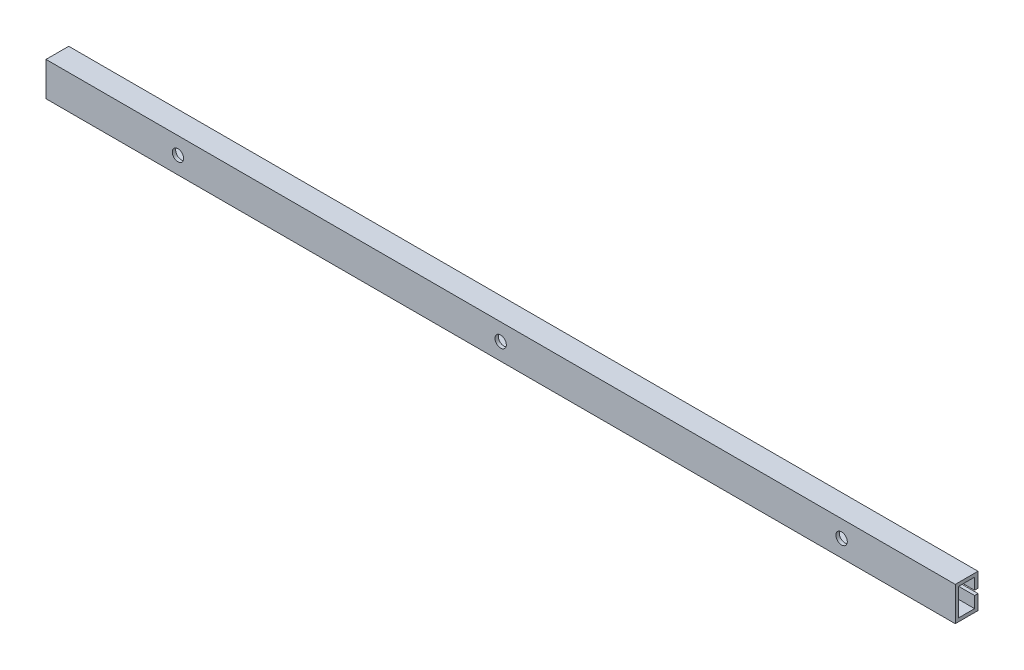
ISO-10303-21;
HEADER;
FILE_DESCRIPTION(('STEP AP214'),'2;1');
FILE_NAME('part.step','',(''),(''),'','','');
FILE_SCHEMA(('AUTOMOTIVE_DESIGN { 1 0 10303 214 1 1 1 1 }'));
ENDSEC;
DATA;
#1=APPLICATION_CONTEXT('core data for automotive mechanical design processes');
#2=APPLICATION_PROTOCOL_DEFINITION('international standard','automotive_design',2000,#1);
#3=PRODUCT_CONTEXT('',#1,'mechanical');
#4=PRODUCT('Part','Part','',(#3));
#5=PRODUCT_RELATED_PRODUCT_CATEGORY('part','',(#4));
#6=PRODUCT_DEFINITION_FORMATION('','',#4);
#7=PRODUCT_DEFINITION_CONTEXT('part definition',#1,'design');
#8=PRODUCT_DEFINITION('design','',#6,#7);
#9=PRODUCT_DEFINITION_SHAPE('','',#8);
#10=(LENGTH_UNIT() NAMED_UNIT(*) SI_UNIT(.MILLI.,.METRE.));
#11=(NAMED_UNIT(*) PLANE_ANGLE_UNIT() SI_UNIT($,.RADIAN.));
#12=(NAMED_UNIT(*) SI_UNIT($,.STERADIAN.) SOLID_ANGLE_UNIT());
#13=UNCERTAINTY_MEASURE_WITH_UNIT(LENGTH_MEASURE(1.E-05),#10,'distance_accuracy_value','');
#14=(GEOMETRIC_REPRESENTATION_CONTEXT(3) GLOBAL_UNCERTAINTY_ASSIGNED_CONTEXT((#13)) GLOBAL_UNIT_ASSIGNED_CONTEXT((#10,
#11,#12)) REPRESENTATION_CONTEXT('',''));
#15=CARTESIAN_POINT('',(0.,0.,0.));
#16=DIRECTION('',(0.,0.,1.));
#17=DIRECTION('',(1.,0.,0.));
#18=AXIS2_PLACEMENT_3D('',#15,#16,#17);
#19=CARTESIAN_POINT('',(0.,0.,0.));
#20=DIRECTION('',(0.,0.,1.));
#21=DIRECTION('',(1.,0.,0.));
#22=AXIS2_PLACEMENT_3D('',#19,#20,#21);
#23=PLANE('',#22);
#24=DIRECTION('',(1.,0.,0.));
#25=VECTOR('',#24,1.);
#26=CARTESIAN_POINT('',(-500.,17.,0.));
#27=LINE('',#26,#25);
#28=CARTESIAN_POINT('',(-400.,17.,0.));
#29=VERTEX_POINT('',#28);
#30=CARTESIAN_POINT('',(400.,17.,0.));
#31=VERTEX_POINT('',#30);
#32=EDGE_CURVE('E257',#29,#31,#27,.T.);
#33=ORIENTED_EDGE('',*,*,#32,.F.);
#34=DIRECTION('',(0.,1.,0.));
#35=VECTOR('',#34,1.);
#36=CARTESIAN_POINT('',(-400.,30.,0.));
#37=LINE('',#36,#35);
#38=CARTESIAN_POINT('',(-400.,30.,0.));
#39=VERTEX_POINT('',#38);
#40=EDGE_CURVE('E146',#29,#39,#37,.T.);
#41=ORIENTED_EDGE('',*,*,#40,.T.);
#42=DIRECTION('',(-1.,0.,0.));
#43=VECTOR('',#42,1.);
#44=CARTESIAN_POINT('',(-500.,30.,0.));
#45=LINE('',#44,#43);
#46=CARTESIAN_POINT('',(400.,30.,0.));
#47=VERTEX_POINT('',#46);
#48=EDGE_CURVE('E164',#47,#39,#45,.T.);
#49=ORIENTED_EDGE('',*,*,#48,.F.);
#50=DIRECTION('',(0.,-1.,0.));
#51=VECTOR('',#50,1.);
#52=CARTESIAN_POINT('',(400.,30.,0.));
#53=LINE('',#52,#51);
#54=EDGE_CURVE('E203',#47,#31,#53,.T.);
#55=ORIENTED_EDGE('',*,*,#54,.T.);
#56=EDGE_LOOP('',(#33,#41,#49,#55));
#57=FACE_BOUND('',#56,.T.);
#58=ADVANCED_FACE('F45',(#57),#23,.F.);
#59=CARTESIAN_POINT('',(-500.,30.,20.));
#60=DIRECTION('',(0.,-1.,0.));
#61=DIRECTION('',(0.,0.,-1.));
#62=AXIS2_PLACEMENT_3D('',#59,#60,#61);
#63=PLANE('',#62);
#64=ORIENTED_EDGE('',*,*,#48,.T.);
#65=DIRECTION('',(0.,0.,1.));
#66=VECTOR('',#65,1.);
#67=CARTESIAN_POINT('',(-400.,30.,0.));
#68=LINE('',#67,#66);
#69=CARTESIAN_POINT('',(-400.,30.,20.));
#70=VERTEX_POINT('',#69);
#71=EDGE_CURVE('E157',#39,#70,#68,.T.);
#72=ORIENTED_EDGE('',*,*,#71,.T.);
#73=DIRECTION('',(-1.,0.,0.));
#74=VECTOR('',#73,1.);
#75=CARTESIAN_POINT('',(-500.,30.,20.));
#76=LINE('',#75,#74);
#77=CARTESIAN_POINT('',(400.,30.,20.));
#78=VERTEX_POINT('',#77);
#79=EDGE_CURVE('E163',#78,#70,#76,.T.);
#80=ORIENTED_EDGE('',*,*,#79,.F.);
#81=DIRECTION('',(0.,0.,1.));
#82=VECTOR('',#81,1.);
#83=CARTESIAN_POINT('',(400.,30.,0.));
#84=LINE('',#83,#82);
#85=EDGE_CURVE('E188',#47,#78,#84,.T.);
#86=ORIENTED_EDGE('',*,*,#85,.F.);
#87=EDGE_LOOP('',(#64,#72,#80,#86));
#88=FACE_BOUND('',#87,.T.);
#89=ADVANCED_FACE('F47',(#88),#63,.F.);
#90=CARTESIAN_POINT('',(-500.,0.,20.));
#91=DIRECTION('',(0.,1.,0.));
#92=DIRECTION('',(0.,0.,1.));
#93=AXIS2_PLACEMENT_3D('',#90,#91,#92);
#94=PLANE('',#93);
#95=DIRECTION('',(1.,0.,0.));
#96=VECTOR('',#95,1.);
#97=CARTESIAN_POINT('',(-500.,0.,20.));
#98=LINE('',#97,#96);
#99=CARTESIAN_POINT('',(-400.,0.,20.));
#100=VERTEX_POINT('',#99);
#101=CARTESIAN_POINT('',(400.,0.,20.));
#102=VERTEX_POINT('',#101);
#103=EDGE_CURVE('E155',#100,#102,#98,.T.);
#104=ORIENTED_EDGE('',*,*,#103,.F.);
#105=DIRECTION('',(0.,0.,1.));
#106=VECTOR('',#105,1.);
#107=CARTESIAN_POINT('',(-400.,0.,0.));
#108=LINE('',#107,#106);
#109=CARTESIAN_POINT('',(-400.,0.,0.));
#110=VERTEX_POINT('',#109);
#111=EDGE_CURVE('E137',#110,#100,#108,.T.);
#112=ORIENTED_EDGE('',*,*,#111,.F.);
#113=DIRECTION('',(1.,0.,0.));
#114=VECTOR('',#113,1.);
#115=CARTESIAN_POINT('',(-500.,0.,0.));
#116=LINE('',#115,#114);
#117=CARTESIAN_POINT('',(400.,0.,0.));
#118=VERTEX_POINT('',#117);
#119=EDGE_CURVE('E153',#110,#118,#116,.T.);
#120=ORIENTED_EDGE('',*,*,#119,.T.);
#121=DIRECTION('',(0.,0.,1.));
#122=VECTOR('',#121,1.);
#123=CARTESIAN_POINT('',(400.,0.,0.));
#124=LINE('',#123,#122);
#125=EDGE_CURVE('E192',#118,#102,#124,.T.);
#126=ORIENTED_EDGE('',*,*,#125,.T.);
#127=EDGE_LOOP('',(#104,#112,#120,#126));
#128=FACE_BOUND('',#127,.T.);
#129=ADVANCED_FACE('F151',(#128),#94,.F.);
#130=CARTESIAN_POINT('',(0.,0.,20.));
#131=DIRECTION('',(0.,0.,1.));
#132=DIRECTION('',(1.,0.,0.));
#133=AXIS2_PLACEMENT_3D('',#130,#131,#132);
#134=PLANE('',#133);
#135=CARTESIAN_POINT('',(300.,15.,20.));
#136=DIRECTION('',(0.,0.,1.));
#137=DIRECTION('',(1.,0.,0.));
#138=AXIS2_PLACEMENT_3D('',#135,#136,#137);
#139=CIRCLE('',#138,4.99999999999999);
#140=CARTESIAN_POINT('',(305.,15.,20.));
#141=VERTEX_POINT('',#140);
#142=EDGE_CURVE('E181',#141,#141,#139,.T.);
#143=ORIENTED_EDGE('',*,*,#142,.F.);
#144=EDGE_LOOP('',(#143));
#145=FACE_BOUND('',#144,.T.);
#146=CARTESIAN_POINT('',(0.,15.,20.));
#147=DIRECTION('',(0.,0.,1.));
#148=DIRECTION('',(1.,0.,0.));
#149=AXIS2_PLACEMENT_3D('',#146,#147,#148);
#150=CIRCLE('',#149,5.);
#151=CARTESIAN_POINT('',(4.99999999999995,15.,20.));
#152=VERTEX_POINT('',#151);
#153=EDGE_CURVE('E429',#152,#152,#150,.T.);
#154=ORIENTED_EDGE('',*,*,#153,.F.);
#155=EDGE_LOOP('',(#154));
#156=FACE_BOUND('',#155,.T.);
#157=CARTESIAN_POINT('',(-283.92,15.,20.));
#158=DIRECTION('',(0.,0.,1.));
#159=DIRECTION('',(1.,0.,0.));
#160=AXIS2_PLACEMENT_3D('',#157,#158,#159);
#161=CIRCLE('',#160,4.99999999999999);
#162=CARTESIAN_POINT('',(-278.92,15.,20.));
#163=VERTEX_POINT('',#162);
#164=EDGE_CURVE('E433',#163,#163,#161,.T.);
#165=ORIENTED_EDGE('',*,*,#164,.F.);
#166=EDGE_LOOP('',(#165));
#167=FACE_BOUND('',#166,.T.);
#168=DIRECTION('',(0.,1.,0.));
#169=VECTOR('',#168,1.);
#170=CARTESIAN_POINT('',(-400.,30.,20.));
#171=LINE('',#170,#169);
#172=EDGE_CURVE('E202',#100,#70,#171,.T.);
#173=ORIENTED_EDGE('',*,*,#172,.F.);
#174=ORIENTED_EDGE('',*,*,#103,.T.);
#175=DIRECTION('',(0.,-1.,0.));
#176=VECTOR('',#175,1.);
#177=CARTESIAN_POINT('',(400.,30.,20.));
#178=LINE('',#177,#176);
#179=EDGE_CURVE('E199',#78,#102,#178,.T.);
#180=ORIENTED_EDGE('',*,*,#179,.F.);
#181=ORIENTED_EDGE('',*,*,#79,.T.);
#182=EDGE_LOOP('',(#173,#174,#180,#181));
#183=FACE_BOUND('',#182,.T.);
#184=ADVANCED_FACE('F280',(#145,#156,#167,#183),#134,.T.);
#185=ORIENTED_EDGE('',*,*,#119,.F.);
#186=CARTESIAN_POINT('',(-400.,12.9987294565265,0.));
#187=VERTEX_POINT('',#186);
#188=EDGE_CURVE('E134',#110,#187,#37,.T.);
#189=ORIENTED_EDGE('',*,*,#188,.T.);
#190=DIRECTION('',(1.,0.,0.));
#191=VECTOR('',#190,1.);
#192=CARTESIAN_POINT('',(-500.,12.9987294565265,0.));
#193=LINE('',#192,#191);
#194=CARTESIAN_POINT('',(400.,12.9987294565265,0.));
#195=VERTEX_POINT('',#194);
#196=EDGE_CURVE('E261',#187,#195,#193,.T.);
#197=ORIENTED_EDGE('',*,*,#196,.T.);
#198=EDGE_CURVE('E161',#195,#118,#53,.T.);
#199=ORIENTED_EDGE('',*,*,#198,.T.);
#200=EDGE_LOOP('',(#185,#189,#197,#199));
#201=FACE_BOUND('',#200,.T.);
#202=ADVANCED_FACE('F160',(#201),#23,.F.);
#203=CARTESIAN_POINT('',(-500.,27.,17.));
#204=DIRECTION('',(0.,1.,0.));
#205=DIRECTION('',(0.,0.,1.));
#206=AXIS2_PLACEMENT_3D('',#203,#204,#205);
#207=PLANE('',#206);
#208=DIRECTION('',(1.,0.,0.));
#209=VECTOR('',#208,1.);
#210=CARTESIAN_POINT('',(-500.,27.,17.));
#211=LINE('',#210,#209);
#212=CARTESIAN_POINT('',(-400.,27.,17.));
#213=VERTEX_POINT('',#212);
#214=CARTESIAN_POINT('',(400.,27.,17.));
#215=VERTEX_POINT('',#214);
#216=EDGE_CURVE('E249',#213,#215,#211,.T.);
#217=ORIENTED_EDGE('',*,*,#216,.F.);
#218=DIRECTION('',(0.,0.,-1.));
#219=VECTOR('',#218,1.);
#220=CARTESIAN_POINT('',(-400.,27.,17.));
#221=LINE('',#220,#219);
#222=CARTESIAN_POINT('',(-400.,27.,3.));
#223=VERTEX_POINT('',#222);
#224=EDGE_CURVE('E63',#213,#223,#221,.T.);
#225=ORIENTED_EDGE('',*,*,#224,.T.);
#226=DIRECTION('',(1.,0.,0.));
#227=VECTOR('',#226,1.);
#228=CARTESIAN_POINT('',(-500.,27.,3.));
#229=LINE('',#228,#227);
#230=CARTESIAN_POINT('',(400.,27.,3.));
#231=VERTEX_POINT('',#230);
#232=EDGE_CURVE('E171',#223,#231,#229,.T.);
#233=ORIENTED_EDGE('',*,*,#232,.T.);
#234=DIRECTION('',(0.,0.,1.));
#235=VECTOR('',#234,1.);
#236=CARTESIAN_POINT('',(400.,27.,17.));
#237=LINE('',#236,#235);
#238=EDGE_CURVE('E217',#231,#215,#237,.T.);
#239=ORIENTED_EDGE('',*,*,#238,.T.);
#240=EDGE_LOOP('',(#217,#225,#233,#239));
#241=FACE_BOUND('',#240,.T.);
#242=ADVANCED_FACE('F302',(#241),#207,.F.);
#243=CARTESIAN_POINT('',(-500.,27.,3.));
#244=DIRECTION('',(0.,0.,-1.));
#245=DIRECTION('',(-1.,0.,0.));
#246=AXIS2_PLACEMENT_3D('',#243,#244,#245);
#247=PLANE('',#246);
#248=ORIENTED_EDGE('',*,*,#232,.F.);
#249=DIRECTION('',(0.,-1.,0.));
#250=VECTOR('',#249,1.);
#251=CARTESIAN_POINT('',(-400.,27.,3.));
#252=LINE('',#251,#250);
#253=CARTESIAN_POINT('',(-400.,17.,3.));
#254=VERTEX_POINT('',#253);
#255=EDGE_CURVE('E241',#223,#254,#252,.T.);
#256=ORIENTED_EDGE('',*,*,#255,.T.);
#257=DIRECTION('',(1.,0.,0.));
#258=VECTOR('',#257,1.);
#259=CARTESIAN_POINT('',(-500.,17.,3.));
#260=LINE('',#259,#258);
#261=CARTESIAN_POINT('',(400.,17.,3.));
#262=VERTEX_POINT('',#261);
#263=EDGE_CURVE('E253',#254,#262,#260,.T.);
#264=ORIENTED_EDGE('',*,*,#263,.T.);
#265=DIRECTION('',(0.,1.,0.));
#266=VECTOR('',#265,1.);
#267=CARTESIAN_POINT('',(400.,27.,3.));
#268=LINE('',#267,#266);
#269=EDGE_CURVE('E221',#262,#231,#268,.T.);
#270=ORIENTED_EDGE('',*,*,#269,.T.);
#271=EDGE_LOOP('',(#248,#256,#264,#270));
#272=FACE_BOUND('',#271,.T.);
#273=ADVANCED_FACE('F299',(#272),#247,.F.);
#274=CARTESIAN_POINT('',(-500.,17.,3.));
#275=DIRECTION('',(0.,1.,0.));
#276=DIRECTION('',(0.,0.,1.));
#277=AXIS2_PLACEMENT_3D('',#274,#275,#276);
#278=PLANE('',#277);
#279=ORIENTED_EDGE('',*,*,#263,.F.);
#280=DIRECTION('',(0.,0.,-1.));
#281=VECTOR('',#280,1.);
#282=CARTESIAN_POINT('',(-400.,17.,3.));
#283=LINE('',#282,#281);
#284=EDGE_CURVE('E245',#254,#29,#283,.T.);
#285=ORIENTED_EDGE('',*,*,#284,.T.);
#286=ORIENTED_EDGE('',*,*,#32,.T.);
#287=DIRECTION('',(0.,0.,1.));
#288=VECTOR('',#287,1.);
#289=CARTESIAN_POINT('',(400.,17.,3.));
#290=LINE('',#289,#288);
#291=EDGE_CURVE('E225',#31,#262,#290,.T.);
#292=ORIENTED_EDGE('',*,*,#291,.T.);
#293=EDGE_LOOP('',(#279,#285,#286,#292));
#294=FACE_BOUND('',#293,.T.);
#295=ADVANCED_FACE('F296',(#294),#278,.F.);
#296=CARTESIAN_POINT('',(-500.,12.9987294565265,3.));
#297=DIRECTION('',(0.,-1.,0.));
#298=DIRECTION('',(0.,0.,-1.));
#299=AXIS2_PLACEMENT_3D('',#296,#297,#298);
#300=PLANE('',#299);
#301=ORIENTED_EDGE('',*,*,#196,.F.);
#302=DIRECTION('',(0.,0.,1.));
#303=VECTOR('',#302,1.);
#304=CARTESIAN_POINT('',(-400.,12.9987294565265,3.));
#305=LINE('',#304,#303);
#306=CARTESIAN_POINT('',(-400.,12.9987294565265,3.));
#307=VERTEX_POINT('',#306);
#308=EDGE_CURVE('E140',#187,#307,#305,.T.);
#309=ORIENTED_EDGE('',*,*,#308,.T.);
#310=DIRECTION('',(1.,0.,0.));
#311=VECTOR('',#310,1.);
#312=CARTESIAN_POINT('',(-500.,12.9987294565265,3.));
#313=LINE('',#312,#311);
#314=CARTESIAN_POINT('',(400.,12.9987294565265,3.));
#315=VERTEX_POINT('',#314);
#316=EDGE_CURVE('E264',#307,#315,#313,.T.);
#317=ORIENTED_EDGE('',*,*,#316,.T.);
#318=DIRECTION('',(0.,0.,-1.));
#319=VECTOR('',#318,1.);
#320=CARTESIAN_POINT('',(400.,12.9987294565265,3.));
#321=LINE('',#320,#319);
#322=EDGE_CURVE('E213',#315,#195,#321,.T.);
#323=ORIENTED_EDGE('',*,*,#322,.T.);
#324=EDGE_LOOP('',(#301,#309,#317,#323));
#325=FACE_BOUND('',#324,.T.);
#326=ADVANCED_FACE('F313',(#325),#300,.F.);
#327=CARTESIAN_POINT('',(-500.,3.,3.));
#328=DIRECTION('',(0.,0.,-1.));
#329=DIRECTION('',(-1.,0.,0.));
#330=AXIS2_PLACEMENT_3D('',#327,#328,#329);
#331=PLANE('',#330);
#332=ORIENTED_EDGE('',*,*,#316,.F.);
#333=DIRECTION('',(0.,-1.,0.));
#334=VECTOR('',#333,1.);
#335=CARTESIAN_POINT('',(-400.,3.,3.));
#336=LINE('',#335,#334);
#337=CARTESIAN_POINT('',(-400.,3.,3.));
#338=VERTEX_POINT('',#337);
#339=EDGE_CURVE('E233',#307,#338,#336,.T.);
#340=ORIENTED_EDGE('',*,*,#339,.T.);
#341=DIRECTION('',(1.,0.,0.));
#342=VECTOR('',#341,1.);
#343=CARTESIAN_POINT('',(-500.,3.,3.));
#344=LINE('',#343,#342);
#345=CARTESIAN_POINT('',(400.,3.,3.));
#346=VERTEX_POINT('',#345);
#347=EDGE_CURVE('E268',#338,#346,#344,.T.);
#348=ORIENTED_EDGE('',*,*,#347,.T.);
#349=DIRECTION('',(0.,1.,0.));
#350=VECTOR('',#349,1.);
#351=CARTESIAN_POINT('',(400.,3.,3.));
#352=LINE('',#351,#350);
#353=EDGE_CURVE('E209',#346,#315,#352,.T.);
#354=ORIENTED_EDGE('',*,*,#353,.T.);
#355=EDGE_LOOP('',(#332,#340,#348,#354));
#356=FACE_BOUND('',#355,.T.);
#357=ADVANCED_FACE('F311',(#356),#331,.F.);
#358=CARTESIAN_POINT('',(-500.,3.,3.));
#359=DIRECTION('',(0.,-1.,0.));
#360=DIRECTION('',(0.,0.,-1.));
#361=AXIS2_PLACEMENT_3D('',#358,#359,#360);
#362=PLANE('',#361);
#363=ORIENTED_EDGE('',*,*,#347,.F.);
#364=DIRECTION('',(0.,0.,1.));
#365=VECTOR('',#364,1.);
#366=CARTESIAN_POINT('',(-400.,3.,3.));
#367=LINE('',#366,#365);
#368=CARTESIAN_POINT('',(-400.,3.,17.));
#369=VERTEX_POINT('',#368);
#370=EDGE_CURVE('E229',#338,#369,#367,.T.);
#371=ORIENTED_EDGE('',*,*,#370,.T.);
#372=DIRECTION('',(1.,0.,0.));
#373=VECTOR('',#372,1.);
#374=CARTESIAN_POINT('',(-500.,3.,17.));
#375=LINE('',#374,#373);
#376=CARTESIAN_POINT('',(400.,3.,17.));
#377=VERTEX_POINT('',#376);
#378=EDGE_CURVE('E272',#369,#377,#375,.T.);
#379=ORIENTED_EDGE('',*,*,#378,.T.);
#380=DIRECTION('',(0.,0.,-1.));
#381=VECTOR('',#380,1.);
#382=CARTESIAN_POINT('',(400.,3.,3.));
#383=LINE('',#382,#381);
#384=EDGE_CURVE('E70',#377,#346,#383,.T.);
#385=ORIENTED_EDGE('',*,*,#384,.T.);
#386=EDGE_LOOP('',(#363,#371,#379,#385));
#387=FACE_BOUND('',#386,.T.);
#388=ADVANCED_FACE('F308',(#387),#362,.F.);
#389=CARTESIAN_POINT('',(-500.,27.,17.));
#390=DIRECTION('',(0.,0.,1.));
#391=DIRECTION('',(0.,-1.,0.));
#392=AXIS2_PLACEMENT_3D('',#389,#390,#391);
#393=PLANE('',#392);
#394=CARTESIAN_POINT('',(300.,15.,17.));
#395=DIRECTION('',(0.,0.,1.));
#396=DIRECTION('',(0.,-1.,0.));
#397=AXIS2_PLACEMENT_3D('',#394,#395,#396);
#398=CIRCLE('',#397,4.99999999999999);
#399=CARTESIAN_POINT('',(300.,10.,17.));
#400=VERTEX_POINT('',#399);
#401=EDGE_CURVE('E49',#400,#400,#398,.T.);
#402=ORIENTED_EDGE('',*,*,#401,.T.);
#403=EDGE_LOOP('',(#402));
#404=FACE_BOUND('',#403,.T.);
#405=CARTESIAN_POINT('',(0.,15.,17.));
#406=DIRECTION('',(0.,0.,1.));
#407=DIRECTION('',(0.,-1.,0.));
#408=AXIS2_PLACEMENT_3D('',#405,#406,#407);
#409=CIRCLE('',#408,5.);
#410=CARTESIAN_POINT('',(0.,9.99999999999999,17.));
#411=VERTEX_POINT('',#410);
#412=EDGE_CURVE('E180',#411,#411,#409,.T.);
#413=ORIENTED_EDGE('',*,*,#412,.T.);
#414=EDGE_LOOP('',(#413));
#415=FACE_BOUND('',#414,.T.);
#416=CARTESIAN_POINT('',(-283.92,15.,17.));
#417=DIRECTION('',(0.,0.,1.));
#418=DIRECTION('',(0.,-1.,0.));
#419=AXIS2_PLACEMENT_3D('',#416,#417,#418);
#420=CIRCLE('',#419,4.99999999999999);
#421=CARTESIAN_POINT('',(-283.92,10.,17.));
#422=VERTEX_POINT('',#421);
#423=EDGE_CURVE('E177',#422,#422,#420,.T.);
#424=ORIENTED_EDGE('',*,*,#423,.T.);
#425=EDGE_LOOP('',(#424));
#426=FACE_BOUND('',#425,.T.);
#427=ORIENTED_EDGE('',*,*,#378,.F.);
#428=DIRECTION('',(0.,1.,0.));
#429=VECTOR('',#428,1.);
#430=CARTESIAN_POINT('',(-400.,27.,17.));
#431=LINE('',#430,#429);
#432=EDGE_CURVE('E11',#369,#213,#431,.T.);
#433=ORIENTED_EDGE('',*,*,#432,.T.);
#434=ORIENTED_EDGE('',*,*,#216,.T.);
#435=DIRECTION('',(0.,-1.,0.));
#436=VECTOR('',#435,1.);
#437=CARTESIAN_POINT('',(400.,27.,17.));
#438=LINE('',#437,#436);
#439=EDGE_CURVE('E55',#215,#377,#438,.T.);
#440=ORIENTED_EDGE('',*,*,#439,.T.);
#441=EDGE_LOOP('',(#427,#433,#434,#440));
#442=FACE_BOUND('',#441,.T.);
#443=ADVANCED_FACE('F305',(#404,#415,#426,#442),#393,.F.);
#444=CARTESIAN_POINT('',(400.,30.,0.));
#445=DIRECTION('',(-1.,0.,0.));
#446=DIRECTION('',(0.,0.,1.));
#447=AXIS2_PLACEMENT_3D('',#444,#445,#446);
#448=PLANE('',#447);
#449=ORIENTED_EDGE('',*,*,#54,.F.);
#450=ORIENTED_EDGE('',*,*,#85,.T.);
#451=ORIENTED_EDGE('',*,*,#179,.T.);
#452=ORIENTED_EDGE('',*,*,#125,.F.);
#453=ORIENTED_EDGE('',*,*,#198,.F.);
#454=ORIENTED_EDGE('',*,*,#322,.F.);
#455=ORIENTED_EDGE('',*,*,#353,.F.);
#456=ORIENTED_EDGE('',*,*,#384,.F.);
#457=ORIENTED_EDGE('',*,*,#439,.F.);
#458=ORIENTED_EDGE('',*,*,#238,.F.);
#459=ORIENTED_EDGE('',*,*,#269,.F.);
#460=ORIENTED_EDGE('',*,*,#291,.F.);
#461=EDGE_LOOP('',(#449,#450,#451,#452,#453,#454,#455,#456,#457,#458,#459,#460));
#462=FACE_BOUND('',#461,.T.);
#463=ADVANCED_FACE('F314',(#462),#448,.F.);
#464=CARTESIAN_POINT('',(-400.,30.,0.));
#465=DIRECTION('',(1.,0.,0.));
#466=DIRECTION('',(0.,0.,-1.));
#467=AXIS2_PLACEMENT_3D('',#464,#465,#466);
#468=PLANE('',#467);
#469=ORIENTED_EDGE('',*,*,#255,.F.);
#470=ORIENTED_EDGE('',*,*,#224,.F.);
#471=ORIENTED_EDGE('',*,*,#432,.F.);
#472=ORIENTED_EDGE('',*,*,#370,.F.);
#473=ORIENTED_EDGE('',*,*,#339,.F.);
#474=ORIENTED_EDGE('',*,*,#308,.F.);
#475=ORIENTED_EDGE('',*,*,#188,.F.);
#476=ORIENTED_EDGE('',*,*,#111,.T.);
#477=ORIENTED_EDGE('',*,*,#172,.T.);
#478=ORIENTED_EDGE('',*,*,#71,.F.);
#479=ORIENTED_EDGE('',*,*,#40,.F.);
#480=ORIENTED_EDGE('',*,*,#284,.F.);
#481=EDGE_LOOP('',(#469,#470,#471,#472,#473,#474,#475,#476,#477,#478,#479,#480));
#482=FACE_BOUND('',#481,.T.);
#483=ADVANCED_FACE('F136',(#482),#468,.F.);
#484=CARTESIAN_POINT('',(-283.92,15.,10.));
#485=DIRECTION('',(0.,0.,1.));
#486=DIRECTION('',(1.,0.,0.));
#487=AXIS2_PLACEMENT_3D('',#484,#485,#486);
#488=CYLINDRICAL_SURFACE('',#487,4.99999999999999);
#489=ORIENTED_EDGE('',*,*,#164,.T.);
#490=EDGE_LOOP('',(#489));
#491=FACE_BOUND('',#490,.T.);
#492=ORIENTED_EDGE('',*,*,#423,.F.);
#493=EDGE_LOOP('',(#492));
#494=FACE_BOUND('',#493,.T.);
#495=ADVANCED_FACE('F322',(#491,#494),#488,.F.);
#496=CARTESIAN_POINT('',(0.,15.,10.));
#497=DIRECTION('',(0.,0.,1.));
#498=DIRECTION('',(1.,0.,0.));
#499=AXIS2_PLACEMENT_3D('',#496,#497,#498);
#500=CYLINDRICAL_SURFACE('',#499,5.);
#501=ORIENTED_EDGE('',*,*,#153,.T.);
#502=EDGE_LOOP('',(#501));
#503=FACE_BOUND('',#502,.T.);
#504=ORIENTED_EDGE('',*,*,#412,.F.);
#505=EDGE_LOOP('',(#504));
#506=FACE_BOUND('',#505,.T.);
#507=ADVANCED_FACE('F403',(#503,#506),#500,.F.);
#508=CARTESIAN_POINT('',(300.,15.,10.));
#509=DIRECTION('',(0.,0.,1.));
#510=DIRECTION('',(1.,0.,0.));
#511=AXIS2_PLACEMENT_3D('',#508,#509,#510);
#512=CYLINDRICAL_SURFACE('',#511,4.99999999999999);
#513=ORIENTED_EDGE('',*,*,#142,.T.);
#514=EDGE_LOOP('',(#513));
#515=FACE_BOUND('',#514,.T.);
#516=ORIENTED_EDGE('',*,*,#401,.F.);
#517=EDGE_LOOP('',(#516));
#518=FACE_BOUND('',#517,.T.);
#519=ADVANCED_FACE('F413',(#515,#518),#512,.F.);
#520=CLOSED_SHELL('',(#58,#89,#129,#184,#202,#242,#273,#295,#326,#357,#388,#443,#463,#483,#495,
#507,#519));
#521=MANIFOLD_SOLID_BREP('B2',#520);
#522=ADVANCED_BREP_SHAPE_REPRESENTATION('',(#18,#521),#14);
#523=SHAPE_DEFINITION_REPRESENTATION(#9,#522);
ENDSEC;
END-ISO-10303-21;
